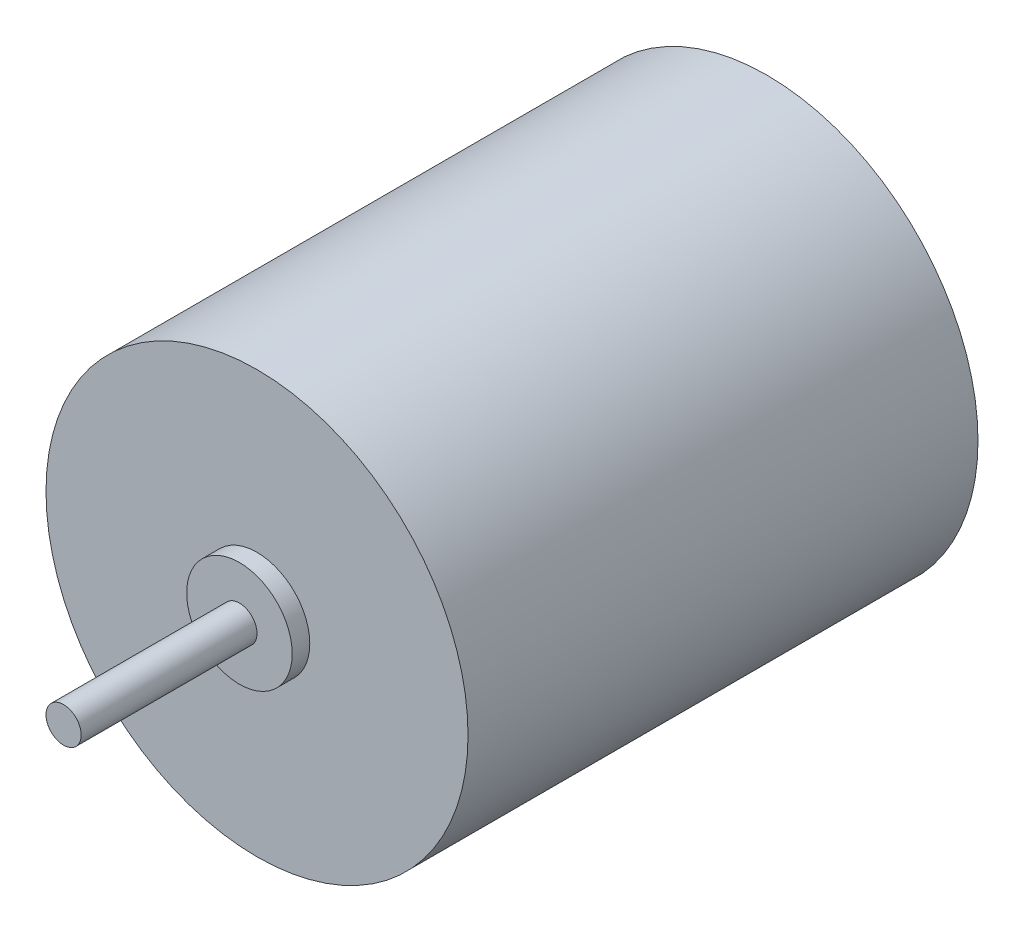
ISO-10303-21;
HEADER;
FILE_DESCRIPTION(('STEP AP214'),'2;1');
FILE_NAME('part.step','',(''),(''),'','','');
FILE_SCHEMA(('AUTOMOTIVE_DESIGN { 1 0 10303 214 1 1 1 1 }'));
ENDSEC;
DATA;
#1=APPLICATION_CONTEXT('core data for automotive mechanical design processes');
#2=APPLICATION_PROTOCOL_DEFINITION('international standard','automotive_design',2000,#1);
#3=PRODUCT_CONTEXT('',#1,'mechanical');
#4=PRODUCT('Part','Part','',(#3));
#5=PRODUCT_RELATED_PRODUCT_CATEGORY('part','',(#4));
#6=PRODUCT_DEFINITION_FORMATION('','',#4);
#7=PRODUCT_DEFINITION_CONTEXT('part definition',#1,'design');
#8=PRODUCT_DEFINITION('design','',#6,#7);
#9=PRODUCT_DEFINITION_SHAPE('','',#8);
#10=(LENGTH_UNIT() NAMED_UNIT(*) SI_UNIT(.MILLI.,.METRE.));
#11=(NAMED_UNIT(*) PLANE_ANGLE_UNIT() SI_UNIT($,.RADIAN.));
#12=(NAMED_UNIT(*) SI_UNIT($,.STERADIAN.) SOLID_ANGLE_UNIT());
#13=UNCERTAINTY_MEASURE_WITH_UNIT(LENGTH_MEASURE(1.E-05),#10,'distance_accuracy_value','');
#14=(GEOMETRIC_REPRESENTATION_CONTEXT(3) GLOBAL_UNCERTAINTY_ASSIGNED_CONTEXT((#13)) GLOBAL_UNIT_ASSIGNED_CONTEXT((#10,
#11,#12)) REPRESENTATION_CONTEXT('',''));
#15=CARTESIAN_POINT('',(0.,0.,0.));
#16=DIRECTION('',(0.,0.,1.));
#17=DIRECTION('',(1.,0.,0.));
#18=AXIS2_PLACEMENT_3D('',#15,#16,#17);
#19=CARTESIAN_POINT('',(0.,0.,29.));
#20=DIRECTION('',(0.,0.,-1.));
#21=DIRECTION('',(-1.,0.,0.));
#22=AXIS2_PLACEMENT_3D('',#19,#20,#21);
#23=CYLINDRICAL_SURFACE('',#22,12.);
#24=CARTESIAN_POINT('',(0.,0.,29.));
#25=DIRECTION('',(0.,0.,1.));
#26=DIRECTION('',(1.,0.,0.));
#27=AXIS2_PLACEMENT_3D('',#24,#25,#26);
#28=CIRCLE('',#27,12.);
#29=CARTESIAN_POINT('',(-12.,0.,29.));
#30=VERTEX_POINT('',#29);
#31=EDGE_CURVE('E51',#30,#30,#28,.T.);
#32=CARTESIAN_POINT('',(0.,0.,0.));
#33=DIRECTION('',(0.,0.,1.));
#34=DIRECTION('',(1.,0.,0.));
#35=AXIS2_PLACEMENT_3D('',#32,#33,#34);
#36=CIRCLE('',#35,12.);
#37=CARTESIAN_POINT('',(-12.,0.,0.));
#38=VERTEX_POINT('',#37);
#39=EDGE_CURVE('E40',#38,#38,#36,.T.);
#40=CARTESIAN_POINT('',(-12.,0.,29.));
#41=CARTESIAN_POINT('',(-12.,0.,28.6979166666667));
#42=CARTESIAN_POINT('',(-12.,0.,28.3958333333333));
#43=CARTESIAN_POINT('',(-12.,0.,27.7916666666667));
#44=CARTESIAN_POINT('',(-12.,0.,27.4895833333333));
#45=CARTESIAN_POINT('',(-12.,0.,26.8854166666667));
#46=CARTESIAN_POINT('',(-12.,0.,26.5833333333333));
#47=CARTESIAN_POINT('',(-12.,0.,25.9791666666667));
#48=CARTESIAN_POINT('',(-12.,0.,25.6770833333333));
#49=CARTESIAN_POINT('',(-12.,0.,25.0729166666667));
#50=CARTESIAN_POINT('',(-12.,0.,24.7708333333333));
#51=CARTESIAN_POINT('',(-12.,0.,24.1666666666667));
#52=CARTESIAN_POINT('',(-12.,0.,23.8645833333333));
#53=CARTESIAN_POINT('',(-12.,0.,23.2604166666667));
#54=CARTESIAN_POINT('',(-12.,0.,22.9583333333333));
#55=CARTESIAN_POINT('',(-12.,0.,22.3541666666667));
#56=CARTESIAN_POINT('',(-12.,0.,22.0520833333333));
#57=CARTESIAN_POINT('',(-12.,0.,21.4479166666667));
#58=CARTESIAN_POINT('',(-12.,0.,21.1458333333333));
#59=CARTESIAN_POINT('',(-12.,0.,20.5416666666667));
#60=CARTESIAN_POINT('',(-12.,0.,20.2395833333333));
#61=CARTESIAN_POINT('',(-12.,0.,19.6354166666667));
#62=CARTESIAN_POINT('',(-12.,0.,19.3333333333333));
#63=CARTESIAN_POINT('',(-12.,0.,18.7291666666667));
#64=CARTESIAN_POINT('',(-12.,0.,18.4270833333333));
#65=CARTESIAN_POINT('',(-12.,0.,17.8229166666667));
#66=CARTESIAN_POINT('',(-12.,0.,17.5208333333333));
#67=CARTESIAN_POINT('',(-12.,0.,16.9166666666667));
#68=CARTESIAN_POINT('',(-12.,0.,16.6145833333333));
#69=CARTESIAN_POINT('',(-12.,0.,16.0104166666667));
#70=CARTESIAN_POINT('',(-12.,0.,15.7083333333333));
#71=CARTESIAN_POINT('',(-12.,0.,15.1041666666667));
#72=CARTESIAN_POINT('',(-12.,0.,14.8020833333333));
#73=CARTESIAN_POINT('',(-12.,0.,14.1979166666667));
#74=CARTESIAN_POINT('',(-12.,0.,13.8958333333333));
#75=CARTESIAN_POINT('',(-12.,0.,13.2916666666667));
#76=CARTESIAN_POINT('',(-12.,0.,12.9895833333333));
#77=CARTESIAN_POINT('',(-12.,0.,12.3854166666667));
#78=CARTESIAN_POINT('',(-12.,0.,12.0833333333333));
#79=CARTESIAN_POINT('',(-12.,0.,11.4791666666667));
#80=CARTESIAN_POINT('',(-12.,0.,11.1770833333333));
#81=CARTESIAN_POINT('',(-12.,0.,10.5729166666667));
#82=CARTESIAN_POINT('',(-12.,0.,10.2708333333333));
#83=CARTESIAN_POINT('',(-12.,0.,9.66666666666667));
#84=CARTESIAN_POINT('',(-12.,0.,9.36458333333333));
#85=CARTESIAN_POINT('',(-12.,0.,8.76041666666667));
#86=CARTESIAN_POINT('',(-12.,0.,8.45833333333333));
#87=CARTESIAN_POINT('',(-12.,0.,7.85416666666667));
#88=CARTESIAN_POINT('',(-12.,0.,7.55208333333333));
#89=CARTESIAN_POINT('',(-12.,0.,6.94791666666667));
#90=CARTESIAN_POINT('',(-12.,0.,6.64583333333333));
#91=CARTESIAN_POINT('',(-12.,0.,6.04166666666667));
#92=CARTESIAN_POINT('',(-12.,0.,5.73958333333333));
#93=CARTESIAN_POINT('',(-12.,0.,5.13541666666667));
#94=CARTESIAN_POINT('',(-12.,0.,4.83333333333333));
#95=CARTESIAN_POINT('',(-12.,0.,4.22916666666667));
#96=CARTESIAN_POINT('',(-12.,0.,3.92708333333333));
#97=CARTESIAN_POINT('',(-12.,0.,3.32291666666667));
#98=CARTESIAN_POINT('',(-12.,0.,3.02083333333333));
#99=CARTESIAN_POINT('',(-12.,0.,2.41666666666667));
#100=CARTESIAN_POINT('',(-12.,0.,2.11458333333333));
#101=CARTESIAN_POINT('',(-12.,0.,1.51041666666667));
#102=CARTESIAN_POINT('',(-12.,0.,1.20833333333333));
#103=CARTESIAN_POINT('',(-12.,0.,0.604166666666667));
#104=CARTESIAN_POINT('',(-12.,0.,0.302083333333333));
#105=CARTESIAN_POINT('',(-12.,0.,0.));
#106=B_SPLINE_CURVE_WITH_KNOTS('',3,(#40,#41,#42,#43,#44,#45,#46,#47,#48,#49,#50,#51,#52,#53,
#54,#55,#56,#57,#58,#59,#60,#61,#62,#63,#64,#65,#66,#67,#68,#69,#70,#71,#72,#73,#74,#75,#76,#77,
#78,#79,#80,#81,#82,#83,#84,#85,#86,#87,#88,#89,#90,#91,#92,#93,#94,#95,#96,#97,#98,#99,#100,
#101,#102,#103,#104,#105),.UNSPECIFIED.,.F.,.F.,(4,2,2,2,2,2,2,2,2,2,2,2,2,2,2,2,2,2,2,2,2,2,2,
2,2,2,2,2,2,2,2,2,4),(0.,0.906249999999997,1.8125,2.71875,3.625,4.53125,5.4375,6.34375,7.25,
8.15625,9.0625,9.96875,10.875,11.78125,12.6875,13.59375,14.5,15.40625,16.3125,17.21875,18.125,
19.03125,19.9375,20.84375,21.75,22.65625,23.5625,24.46875,25.375,26.28125,27.1875,28.09375,29.),.UNSPECIFIED.);
#107=EDGE_CURVE('BSEAM37',#30,#38,#106,.T.);
#108=ORIENTED_EDGE('',*,*,#31,.F.);
#109=ORIENTED_EDGE('',*,*,#39,.T.);
#110=ORIENTED_EDGE('',*,*,#107,.T.);
#111=ORIENTED_EDGE('',*,*,#107,.F.);
#112=EDGE_LOOP('',(#108,#110,#109,#111));
#113=FACE_BOUND('',#112,.T.);
#114=ADVANCED_FACE('F37',(#113),#23,.T.);
#115=CARTESIAN_POINT('',(0.,0.,29.));
#116=DIRECTION('',(0.,0.,1.));
#117=DIRECTION('',(1.,0.,0.));
#118=AXIS2_PLACEMENT_3D('',#115,#116,#117);
#119=PLANE('',#118);
#120=CARTESIAN_POINT('',(0.,0.,29.));
#121=DIRECTION('',(0.,0.,1.));
#122=DIRECTION('',(1.,0.,0.));
#123=AXIS2_PLACEMENT_3D('',#120,#121,#122);
#124=CIRCLE('',#123,3.);
#125=CARTESIAN_POINT('',(3.,0.,29.));
#126=VERTEX_POINT('',#125);
#127=EDGE_CURVE('E45',#126,#126,#124,.T.);
#128=ORIENTED_EDGE('',*,*,#127,.F.);
#129=EDGE_LOOP('',(#128));
#130=FACE_BOUND('',#129,.T.);
#131=ORIENTED_EDGE('',*,*,#31,.T.);
#132=EDGE_LOOP('',(#131));
#133=FACE_BOUND('',#132,.T.);
#134=ADVANCED_FACE('F71',(#130,#133),#119,.T.);
#135=CARTESIAN_POINT('',(0.,0.,0.));
#136=DIRECTION('',(0.,0.,1.));
#137=DIRECTION('',(1.,0.,0.));
#138=AXIS2_PLACEMENT_3D('',#135,#136,#137);
#139=PLANE('',#138);
#140=ORIENTED_EDGE('',*,*,#39,.F.);
#141=EDGE_LOOP('',(#140));
#142=FACE_BOUND('',#141,.T.);
#143=ADVANCED_FACE('F68',(#142),#139,.F.);
#144=CARTESIAN_POINT('',(0.,0.,30.));
#145=DIRECTION('',(0.,0.,-1.));
#146=DIRECTION('',(-1.,0.,0.));
#147=AXIS2_PLACEMENT_3D('',#144,#145,#146);
#148=CYLINDRICAL_SURFACE('',#147,3.);
#149=CARTESIAN_POINT('',(0.,0.,30.));
#150=DIRECTION('',(0.,0.,1.));
#151=DIRECTION('',(1.,0.,0.));
#152=AXIS2_PLACEMENT_3D('',#149,#150,#151);
#153=CIRCLE('',#152,3.);
#154=CARTESIAN_POINT('',(3.,0.,30.));
#155=VERTEX_POINT('',#154);
#156=EDGE_CURVE('E56',#155,#155,#153,.T.);
#157=ORIENTED_EDGE('',*,*,#156,.F.);
#158=EDGE_LOOP('',(#157));
#159=FACE_BOUND('',#158,.T.);
#160=ORIENTED_EDGE('',*,*,#127,.T.);
#161=EDGE_LOOP('',(#160));
#162=FACE_BOUND('',#161,.T.);
#163=ADVANCED_FACE('F70',(#159,#162),#148,.T.);
#164=CARTESIAN_POINT('',(0.,0.,30.));
#165=DIRECTION('',(0.,0.,1.));
#166=DIRECTION('',(1.,0.,0.));
#167=AXIS2_PLACEMENT_3D('',#164,#165,#166);
#168=PLANE('',#167);
#169=CARTESIAN_POINT('',(0.,0.,30.));
#170=DIRECTION('',(0.,0.,1.));
#171=DIRECTION('',(1.,0.,0.));
#172=AXIS2_PLACEMENT_3D('',#169,#170,#171);
#173=CIRCLE('',#172,1.);
#174=CARTESIAN_POINT('',(1.,0.,30.));
#175=VERTEX_POINT('',#174);
#176=EDGE_CURVE('E10',#175,#175,#173,.T.);
#177=ORIENTED_EDGE('',*,*,#176,.F.);
#178=EDGE_LOOP('',(#177));
#179=FACE_BOUND('',#178,.T.);
#180=ORIENTED_EDGE('',*,*,#156,.T.);
#181=EDGE_LOOP('',(#180));
#182=FACE_BOUND('',#181,.T.);
#183=ADVANCED_FACE('F76',(#179,#182),#168,.T.);
#184=CARTESIAN_POINT('',(0.,0.,40.));
#185=DIRECTION('',(0.,0.,-1.));
#186=DIRECTION('',(-1.,0.,0.));
#187=AXIS2_PLACEMENT_3D('',#184,#185,#186);
#188=CYLINDRICAL_SURFACE('',#187,1.);
#189=CARTESIAN_POINT('',(0.,0.,40.));
#190=DIRECTION('',(0.,0.,1.));
#191=DIRECTION('',(1.,0.,0.));
#192=AXIS2_PLACEMENT_3D('',#189,#190,#191);
#193=CIRCLE('',#192,1.);
#194=CARTESIAN_POINT('',(1.,0.,40.));
#195=VERTEX_POINT('',#194);
#196=EDGE_CURVE('E55',#195,#195,#193,.T.);
#197=ORIENTED_EDGE('',*,*,#196,.F.);
#198=EDGE_LOOP('',(#197));
#199=FACE_BOUND('',#198,.T.);
#200=ORIENTED_EDGE('',*,*,#176,.T.);
#201=EDGE_LOOP('',(#200));
#202=FACE_BOUND('',#201,.T.);
#203=ADVANCED_FACE('F106',(#199,#202),#188,.T.);
#204=CARTESIAN_POINT('',(0.,0.,40.));
#205=DIRECTION('',(0.,0.,1.));
#206=DIRECTION('',(1.,0.,0.));
#207=AXIS2_PLACEMENT_3D('',#204,#205,#206);
#208=PLANE('',#207);
#209=ORIENTED_EDGE('',*,*,#196,.T.);
#210=EDGE_LOOP('',(#209));
#211=FACE_BOUND('',#210,.T.);
#212=ADVANCED_FACE('F116',(#211),#208,.T.);
#213=CLOSED_SHELL('',(#114,#134,#143,#163,#183,#203,#212));
#214=MANIFOLD_SOLID_BREP('B2',#213);
#215=ADVANCED_BREP_SHAPE_REPRESENTATION('',(#18,#214),#14);
#216=SHAPE_DEFINITION_REPRESENTATION(#9,#215);
ENDSEC;
END-ISO-10303-21;
